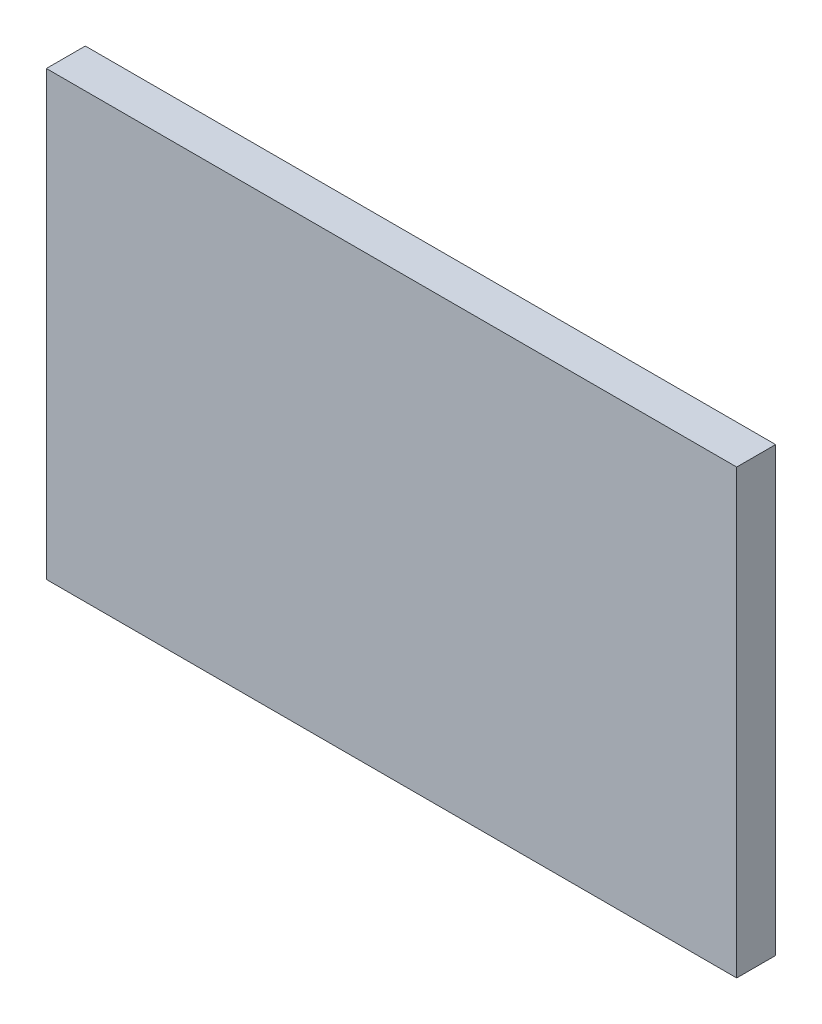
ISO-10303-21;
HEADER;
FILE_DESCRIPTION(('STEP AP214'),'2;1');
FILE_NAME('part.step','',(''),(''),'','','');
FILE_SCHEMA(('AUTOMOTIVE_DESIGN { 1 0 10303 214 1 1 1 1 }'));
ENDSEC;
DATA;
#1=APPLICATION_CONTEXT('core data for automotive mechanical design processes');
#2=APPLICATION_PROTOCOL_DEFINITION('international standard','automotive_design',2000,#1);
#3=PRODUCT_CONTEXT('',#1,'mechanical');
#4=PRODUCT('Part','Part','',(#3));
#5=PRODUCT_RELATED_PRODUCT_CATEGORY('part','',(#4));
#6=PRODUCT_DEFINITION_FORMATION('','',#4);
#7=PRODUCT_DEFINITION_CONTEXT('part definition',#1,'design');
#8=PRODUCT_DEFINITION('design','',#6,#7);
#9=PRODUCT_DEFINITION_SHAPE('','',#8);
#10=(LENGTH_UNIT() NAMED_UNIT(*) SI_UNIT(.MILLI.,.METRE.));
#11=(NAMED_UNIT(*) PLANE_ANGLE_UNIT() SI_UNIT($,.RADIAN.));
#12=(NAMED_UNIT(*) SI_UNIT($,.STERADIAN.) SOLID_ANGLE_UNIT());
#13=UNCERTAINTY_MEASURE_WITH_UNIT(LENGTH_MEASURE(1.E-05),#10,'distance_accuracy_value','');
#14=(GEOMETRIC_REPRESENTATION_CONTEXT(3) GLOBAL_UNCERTAINTY_ASSIGNED_CONTEXT((#13)) GLOBAL_UNIT_ASSIGNED_CONTEXT((#10,
#11,#12)) REPRESENTATION_CONTEXT('',''));
#15=CARTESIAN_POINT('',(0.,0.,0.));
#16=DIRECTION('',(0.,0.,1.));
#17=DIRECTION('',(1.,0.,0.));
#18=AXIS2_PLACEMENT_3D('',#15,#16,#17);
#19=CARTESIAN_POINT('',(49.53,-31.75,5.588));
#20=DIRECTION('',(-1.,0.,0.));
#21=DIRECTION('',(0.,0.,1.));
#22=AXIS2_PLACEMENT_3D('',#19,#20,#21);
#23=PLANE('',#22);
#24=DIRECTION('',(0.,1.,0.));
#25=VECTOR('',#24,1.);
#26=CARTESIAN_POINT('',(49.53,-31.75,0.));
#27=LINE('',#26,#25);
#28=CARTESIAN_POINT('',(49.53,-31.75,0.));
#29=VERTEX_POINT('',#28);
#30=CARTESIAN_POINT('',(49.53,31.75,0.));
#31=VERTEX_POINT('',#30);
#32=EDGE_CURVE('E96',#29,#31,#27,.T.);
#33=ORIENTED_EDGE('',*,*,#32,.T.);
#34=DIRECTION('',(0.,0.,-1.));
#35=VECTOR('',#34,1.);
#36=CARTESIAN_POINT('',(49.53,31.75,5.588));
#37=LINE('',#36,#35);
#38=CARTESIAN_POINT('',(49.53,31.75,5.588));
#39=VERTEX_POINT('',#38);
#40=EDGE_CURVE('E11',#39,#31,#37,.T.);
#41=ORIENTED_EDGE('',*,*,#40,.F.);
#42=DIRECTION('',(0.,1.,0.));
#43=VECTOR('',#42,1.);
#44=CARTESIAN_POINT('',(49.53,-31.75,5.588));
#45=LINE('',#44,#43);
#46=CARTESIAN_POINT('',(49.53,-31.75,5.588));
#47=VERTEX_POINT('',#46);
#48=EDGE_CURVE('E84',#47,#39,#45,.T.);
#49=ORIENTED_EDGE('',*,*,#48,.F.);
#50=DIRECTION('',(0.,0.,-1.));
#51=VECTOR('',#50,1.);
#52=CARTESIAN_POINT('',(49.53,-31.75,5.588));
#53=LINE('',#52,#51);
#54=EDGE_CURVE('E92',#47,#29,#53,.T.);
#55=ORIENTED_EDGE('',*,*,#54,.T.);
#56=EDGE_LOOP('',(#33,#41,#49,#55));
#57=FACE_BOUND('',#56,.T.);
#58=ADVANCED_FACE('F33',(#57),#23,.F.);
#59=CARTESIAN_POINT('',(-49.53,31.75,5.588));
#60=DIRECTION('',(0.,-1.,0.));
#61=DIRECTION('',(0.,0.,-1.));
#62=AXIS2_PLACEMENT_3D('',#59,#60,#61);
#63=PLANE('',#62);
#64=DIRECTION('',(-1.,0.,0.));
#65=VECTOR('',#64,1.);
#66=CARTESIAN_POINT('',(-49.53,31.75,0.));
#67=LINE('',#66,#65);
#68=CARTESIAN_POINT('',(-49.53,31.75,0.));
#69=VERTEX_POINT('',#68);
#70=EDGE_CURVE('E88',#31,#69,#67,.T.);
#71=ORIENTED_EDGE('',*,*,#70,.T.);
#72=DIRECTION('',(0.,0.,-1.));
#73=VECTOR('',#72,1.);
#74=CARTESIAN_POINT('',(-49.53,31.75,5.588));
#75=LINE('',#74,#73);
#76=CARTESIAN_POINT('',(-49.53,31.75,5.588));
#77=VERTEX_POINT('',#76);
#78=EDGE_CURVE('E41',#77,#69,#75,.T.);
#79=ORIENTED_EDGE('',*,*,#78,.F.);
#80=DIRECTION('',(-1.,0.,0.));
#81=VECTOR('',#80,1.);
#82=CARTESIAN_POINT('',(-49.53,31.75,5.588));
#83=LINE('',#82,#81);
#84=EDGE_CURVE('E79',#39,#77,#83,.T.);
#85=ORIENTED_EDGE('',*,*,#84,.F.);
#86=ORIENTED_EDGE('',*,*,#40,.T.);
#87=EDGE_LOOP('',(#71,#79,#85,#86));
#88=FACE_BOUND('',#87,.T.);
#89=ADVANCED_FACE('F87',(#88),#63,.F.);
#90=CARTESIAN_POINT('',(-49.53,-31.75,5.588));
#91=DIRECTION('',(1.,0.,0.));
#92=DIRECTION('',(0.,0.,-1.));
#93=AXIS2_PLACEMENT_3D('',#90,#91,#92);
#94=PLANE('',#93);
#95=DIRECTION('',(0.,-1.,0.));
#96=VECTOR('',#95,1.);
#97=CARTESIAN_POINT('',(-49.53,-31.75,0.));
#98=LINE('',#97,#96);
#99=CARTESIAN_POINT('',(-49.53,-31.75,0.));
#100=VERTEX_POINT('',#99);
#101=EDGE_CURVE('E66',#69,#100,#98,.T.);
#102=ORIENTED_EDGE('',*,*,#101,.T.);
#103=DIRECTION('',(0.,0.,-1.));
#104=VECTOR('',#103,1.);
#105=CARTESIAN_POINT('',(-49.53,-31.75,5.588));
#106=LINE('',#105,#104);
#107=CARTESIAN_POINT('',(-49.53,-31.75,5.588));
#108=VERTEX_POINT('',#107);
#109=EDGE_CURVE('E89',#108,#100,#106,.T.);
#110=ORIENTED_EDGE('',*,*,#109,.F.);
#111=DIRECTION('',(0.,-1.,0.));
#112=VECTOR('',#111,1.);
#113=CARTESIAN_POINT('',(-49.53,-31.75,5.588));
#114=LINE('',#113,#112);
#115=EDGE_CURVE('E82',#77,#108,#114,.T.);
#116=ORIENTED_EDGE('',*,*,#115,.F.);
#117=ORIENTED_EDGE('',*,*,#78,.T.);
#118=EDGE_LOOP('',(#102,#110,#116,#117));
#119=FACE_BOUND('',#118,.T.);
#120=ADVANCED_FACE('F90',(#119),#94,.F.);
#121=CARTESIAN_POINT('',(-49.53,-31.75,5.588));
#122=DIRECTION('',(0.,1.,0.));
#123=DIRECTION('',(0.,0.,1.));
#124=AXIS2_PLACEMENT_3D('',#121,#122,#123);
#125=PLANE('',#124);
#126=DIRECTION('',(1.,0.,0.));
#127=VECTOR('',#126,1.);
#128=CARTESIAN_POINT('',(-49.53,-31.75,0.));
#129=LINE('',#128,#127);
#130=EDGE_CURVE('E72',#100,#29,#129,.T.);
#131=ORIENTED_EDGE('',*,*,#130,.T.);
#132=ORIENTED_EDGE('',*,*,#54,.F.);
#133=DIRECTION('',(1.,0.,0.));
#134=VECTOR('',#133,1.);
#135=CARTESIAN_POINT('',(-49.53,-31.75,5.588));
#136=LINE('',#135,#134);
#137=EDGE_CURVE('E49',#108,#47,#136,.T.);
#138=ORIENTED_EDGE('',*,*,#137,.F.);
#139=ORIENTED_EDGE('',*,*,#109,.T.);
#140=EDGE_LOOP('',(#131,#132,#138,#139));
#141=FACE_BOUND('',#140,.T.);
#142=ADVANCED_FACE('F103',(#141),#125,.F.);
#143=CARTESIAN_POINT('',(0.,0.,5.588));
#144=DIRECTION('',(0.,0.,-1.));
#145=DIRECTION('',(-1.,0.,0.));
#146=AXIS2_PLACEMENT_3D('',#143,#144,#145);
#147=PLANE('',#146);
#148=ORIENTED_EDGE('',*,*,#48,.T.);
#149=ORIENTED_EDGE('',*,*,#84,.T.);
#150=ORIENTED_EDGE('',*,*,#115,.T.);
#151=ORIENTED_EDGE('',*,*,#137,.T.);
#152=EDGE_LOOP('',(#148,#149,#150,#151));
#153=FACE_BOUND('',#152,.T.);
#154=ADVANCED_FACE('F80',(#153),#147,.F.);
#155=CARTESIAN_POINT('',(0.,0.,0.));
#156=DIRECTION('',(0.,0.,-1.));
#157=DIRECTION('',(-1.,0.,0.));
#158=AXIS2_PLACEMENT_3D('',#155,#156,#157);
#159=PLANE('',#158);
#160=ORIENTED_EDGE('',*,*,#32,.F.);
#161=ORIENTED_EDGE('',*,*,#130,.F.);
#162=ORIENTED_EDGE('',*,*,#101,.F.);
#163=ORIENTED_EDGE('',*,*,#70,.F.);
#164=EDGE_LOOP('',(#160,#161,#162,#163));
#165=FACE_BOUND('',#164,.T.);
#166=ADVANCED_FACE('F106',(#165),#159,.T.);
#167=CLOSED_SHELL('',(#58,#89,#120,#142,#154,#166));
#168=MANIFOLD_SOLID_BREP('B2',#167);
#169=ADVANCED_BREP_SHAPE_REPRESENTATION('',(#18,#168),#14);
#170=SHAPE_DEFINITION_REPRESENTATION(#9,#169);
ENDSEC;
END-ISO-10303-21;
